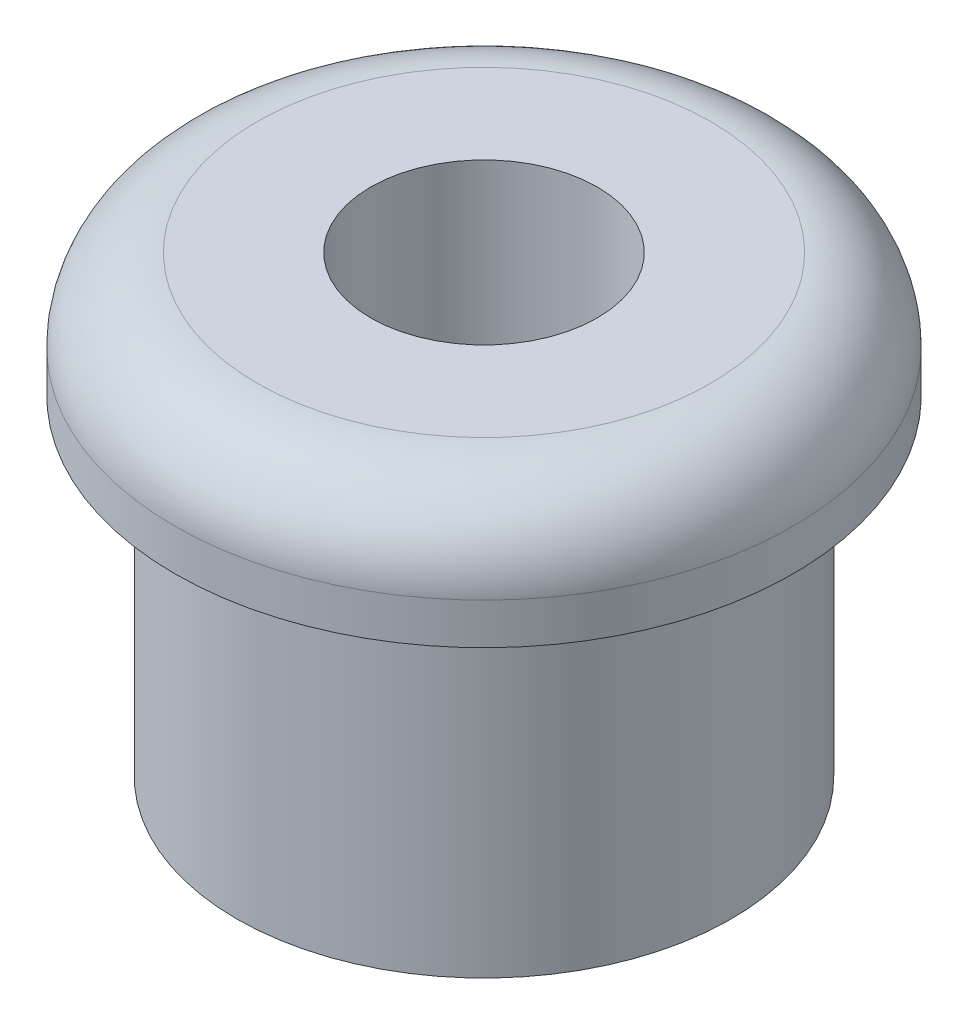
ISO-10303-21;
HEADER;
FILE_DESCRIPTION(('STEP AP214'),'2;1');
FILE_NAME('part.step','',(''),(''),'','','');
FILE_SCHEMA(('AUTOMOTIVE_DESIGN { 1 0 10303 214 1 1 1 1 }'));
ENDSEC;
DATA;
#1=APPLICATION_CONTEXT('core data for automotive mechanical design processes');
#2=APPLICATION_PROTOCOL_DEFINITION('international standard','automotive_design',2000,#1);
#3=PRODUCT_CONTEXT('',#1,'mechanical');
#4=PRODUCT('Part','Part','',(#3));
#5=PRODUCT_RELATED_PRODUCT_CATEGORY('part','',(#4));
#6=PRODUCT_DEFINITION_FORMATION('','',#4);
#7=PRODUCT_DEFINITION_CONTEXT('part definition',#1,'design');
#8=PRODUCT_DEFINITION('design','',#6,#7);
#9=PRODUCT_DEFINITION_SHAPE('','',#8);
#10=(LENGTH_UNIT() NAMED_UNIT(*) SI_UNIT(.MILLI.,.METRE.));
#11=(NAMED_UNIT(*) PLANE_ANGLE_UNIT() SI_UNIT($,.RADIAN.));
#12=(NAMED_UNIT(*) SI_UNIT($,.STERADIAN.) SOLID_ANGLE_UNIT());
#13=UNCERTAINTY_MEASURE_WITH_UNIT(LENGTH_MEASURE(1.E-05),#10,'distance_accuracy_value','');
#14=(GEOMETRIC_REPRESENTATION_CONTEXT(3) GLOBAL_UNCERTAINTY_ASSIGNED_CONTEXT((#13)) GLOBAL_UNIT_ASSIGNED_CONTEXT((#10,
#11,#12)) REPRESENTATION_CONTEXT('',''));
#15=CARTESIAN_POINT('',(0.,0.,0.));
#16=DIRECTION('',(0.,0.,1.));
#17=DIRECTION('',(1.,0.,0.));
#18=AXIS2_PLACEMENT_3D('',#15,#16,#17);
#19=CARTESIAN_POINT('',(0.,0.,0.));
#20=DIRECTION('',(0.,1.,0.));
#21=DIRECTION('',(0.,0.,1.));
#22=AXIS2_PLACEMENT_3D('',#19,#20,#21);
#23=PLANE('',#22);
#24=CARTESIAN_POINT('',(0.,0.,0.));
#25=DIRECTION('',(0.,1.,0.));
#26=DIRECTION('',(0.,0.,1.));
#27=AXIS2_PLACEMENT_3D('',#24,#25,#26);
#28=CIRCLE('',#27,6.);
#29=CARTESIAN_POINT('',(0.,0.,6.));
#30=VERTEX_POINT('',#29);
#31=EDGE_CURVE('E47',#30,#30,#28,.T.);
#32=ORIENTED_EDGE('',*,*,#31,.F.);
#33=EDGE_LOOP('',(#32));
#34=FACE_BOUND('',#33,.T.);
#35=CARTESIAN_POINT('',(0.,0.,0.));
#36=DIRECTION('',(0.,1.,0.));
#37=DIRECTION('',(0.,0.,1.));
#38=AXIS2_PLACEMENT_3D('',#35,#36,#37);
#39=CIRCLE('',#38,2.75);
#40=CARTESIAN_POINT('',(0.,0.,2.75));
#41=VERTEX_POINT('',#40);
#42=EDGE_CURVE('E51',#41,#41,#39,.T.);
#43=ORIENTED_EDGE('',*,*,#42,.T.);
#44=EDGE_LOOP('',(#43));
#45=FACE_BOUND('',#44,.T.);
#46=ADVANCED_FACE('F32',(#34,#45),#23,.F.);
#47=CARTESIAN_POINT('',(0.,8.,0.));
#48=DIRECTION('',(0.,-1.,0.));
#49=DIRECTION('',(0.,0.,-1.));
#50=AXIS2_PLACEMENT_3D('',#47,#48,#49);
#51=CYLINDRICAL_SURFACE('',#50,6.);
#52=CARTESIAN_POINT('',(0.,8.,0.));
#53=DIRECTION('',(0.,1.,0.));
#54=DIRECTION('',(0.,0.,1.));
#55=AXIS2_PLACEMENT_3D('',#52,#53,#54);
#56=CIRCLE('',#55,6.);
#57=CARTESIAN_POINT('',(0.,8.,6.));
#58=VERTEX_POINT('',#57);
#59=EDGE_CURVE('E43',#58,#58,#56,.T.);
#60=ORIENTED_EDGE('',*,*,#59,.F.);
#61=EDGE_LOOP('',(#60));
#62=FACE_BOUND('',#61,.T.);
#63=ORIENTED_EDGE('',*,*,#31,.T.);
#64=EDGE_LOOP('',(#63));
#65=FACE_BOUND('',#64,.T.);
#66=ADVANCED_FACE('F75',(#62,#65),#51,.T.);
#67=CARTESIAN_POINT('',(0.,8.,0.));
#68=DIRECTION('',(0.,-1.,0.));
#69=DIRECTION('',(0.,0.,-1.));
#70=AXIS2_PLACEMENT_3D('',#67,#68,#69);
#71=CYLINDRICAL_SURFACE('',#70,2.75);
#72=ORIENTED_EDGE('',*,*,#42,.F.);
#73=EDGE_LOOP('',(#72));
#74=FACE_BOUND('',#73,.T.);
#75=CARTESIAN_POINT('',(0.,11.,0.));
#76=DIRECTION('',(0.,1.,0.));
#77=DIRECTION('',(0.,0.,1.));
#78=AXIS2_PLACEMENT_3D('',#75,#76,#77);
#79=CIRCLE('',#78,2.75);
#80=CARTESIAN_POINT('',(0.,11.,2.75));
#81=VERTEX_POINT('',#80);
#82=EDGE_CURVE('E58',#81,#81,#79,.T.);
#83=ORIENTED_EDGE('',*,*,#82,.T.);
#84=EDGE_LOOP('',(#83));
#85=FACE_BOUND('',#84,.T.);
#86=ADVANCED_FACE('F62',(#74,#85),#71,.F.);
#87=CARTESIAN_POINT('',(0.,11.,0.));
#88=DIRECTION('',(0.,1.,0.));
#89=DIRECTION('',(0.,0.,1.));
#90=AXIS2_PLACEMENT_3D('',#87,#88,#89);
#91=PLANE('',#90);
#92=CARTESIAN_POINT('',(0.,11.,0.));
#93=DIRECTION('',(0.,1.,0.));
#94=DIRECTION('',(0.,0.,1.));
#95=AXIS2_PLACEMENT_3D('',#92,#93,#94);
#96=CIRCLE('',#95,5.5);
#97=CARTESIAN_POINT('',(0.,11.,5.5));
#98=VERTEX_POINT('',#97);
#99=EDGE_CURVE('E39',#98,#98,#96,.T.);
#100=ORIENTED_EDGE('',*,*,#99,.T.);
#101=EDGE_LOOP('',(#100));
#102=FACE_BOUND('',#101,.T.);
#103=ORIENTED_EDGE('',*,*,#82,.F.);
#104=EDGE_LOOP('',(#103));
#105=FACE_BOUND('',#104,.T.);
#106=ADVANCED_FACE('F64',(#102,#105),#91,.T.);
#107=CARTESIAN_POINT('',(0.,8.,0.));
#108=DIRECTION('',(0.,1.,0.));
#109=DIRECTION('',(0.,0.,1.));
#110=AXIS2_PLACEMENT_3D('',#107,#108,#109);
#111=PLANE('',#110);
#112=ORIENTED_EDGE('',*,*,#59,.T.);
#113=EDGE_LOOP('',(#112));
#114=FACE_BOUND('',#113,.T.);
#115=CARTESIAN_POINT('',(0.,8.,0.));
#116=DIRECTION('',(0.,1.,0.));
#117=DIRECTION('',(0.,0.,1.));
#118=AXIS2_PLACEMENT_3D('',#115,#116,#117);
#119=CIRCLE('',#118,7.5);
#120=CARTESIAN_POINT('',(0.,8.,7.5));
#121=VERTEX_POINT('',#120);
#122=EDGE_CURVE('E55',#121,#121,#119,.T.);
#123=ORIENTED_EDGE('',*,*,#122,.F.);
#124=EDGE_LOOP('',(#123));
#125=FACE_BOUND('',#124,.T.);
#126=ADVANCED_FACE('F66',(#114,#125),#111,.F.);
#127=CARTESIAN_POINT('',(0.,11.,0.));
#128=DIRECTION('',(0.,-1.,0.));
#129=DIRECTION('',(0.,0.,-1.));
#130=AXIS2_PLACEMENT_3D('',#127,#128,#129);
#131=CYLINDRICAL_SURFACE('',#130,7.5);
#132=CARTESIAN_POINT('',(0.,9.,0.));
#133=DIRECTION('',(0.,1.,0.));
#134=DIRECTION('',(0.,0.,1.));
#135=AXIS2_PLACEMENT_3D('',#132,#133,#134);
#136=CIRCLE('',#135,7.5);
#137=CARTESIAN_POINT('',(0.,9.,7.5));
#138=VERTEX_POINT('',#137);
#139=EDGE_CURVE('E10',#138,#138,#136,.F.);
#140=ORIENTED_EDGE('',*,*,#139,.T.);
#141=EDGE_LOOP('',(#140));
#142=FACE_BOUND('',#141,.T.);
#143=ORIENTED_EDGE('',*,*,#122,.T.);
#144=EDGE_LOOP('',(#143));
#145=FACE_BOUND('',#144,.T.);
#146=ADVANCED_FACE('F72',(#142,#145),#131,.T.);
#147=CARTESIAN_POINT('',(0.,9.,0.));
#148=DIRECTION('',(0.,1.,0.));
#149=DIRECTION('',(0.,0.,1.));
#150=AXIS2_PLACEMENT_3D('',#147,#148,#149);
#151=TOROIDAL_SURFACE('',#150,5.5,2.);
#152=ORIENTED_EDGE('',*,*,#139,.F.);
#153=EDGE_LOOP('',(#152));
#154=FACE_BOUND('',#153,.T.);
#155=ORIENTED_EDGE('',*,*,#99,.F.);
#156=EDGE_LOOP('',(#155));
#157=FACE_BOUND('',#156,.T.);
#158=ADVANCED_FACE('F34',(#154,#157),#151,.T.);
#159=CLOSED_SHELL('',(#46,#66,#86,#106,#126,#146,#158));
#160=MANIFOLD_SOLID_BREP('B2',#159);
#161=ADVANCED_BREP_SHAPE_REPRESENTATION('',(#18,#160),#14);
#162=SHAPE_DEFINITION_REPRESENTATION(#9,#161);
ENDSEC;
END-ISO-10303-21;
